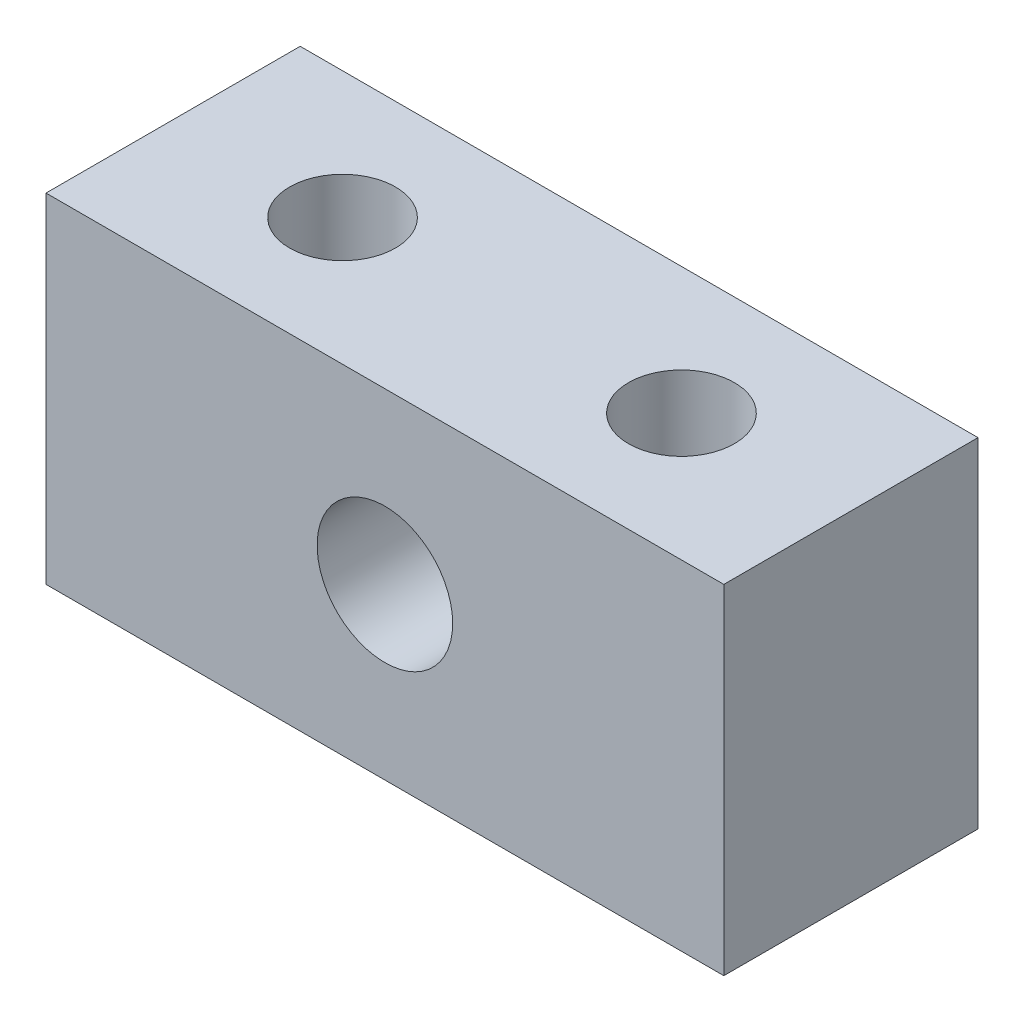
ISO-10303-21;
HEADER;
FILE_DESCRIPTION(('STEP AP214'),'2;1');
FILE_NAME('part.step','',(''),(''),'','','');
FILE_SCHEMA(('AUTOMOTIVE_DESIGN { 1 0 10303 214 1 1 1 1 }'));
ENDSEC;
DATA;
#1=APPLICATION_CONTEXT('core data for automotive mechanical design processes');
#2=APPLICATION_PROTOCOL_DEFINITION('international standard','automotive_design',2000,#1);
#3=PRODUCT_CONTEXT('',#1,'mechanical');
#4=PRODUCT('Part','Part','',(#3));
#5=PRODUCT_RELATED_PRODUCT_CATEGORY('part','',(#4));
#6=PRODUCT_DEFINITION_FORMATION('','',#4);
#7=PRODUCT_DEFINITION_CONTEXT('part definition',#1,'design');
#8=PRODUCT_DEFINITION('design','',#6,#7);
#9=PRODUCT_DEFINITION_SHAPE('','',#8);
#10=(LENGTH_UNIT() NAMED_UNIT(*) SI_UNIT(.MILLI.,.METRE.));
#11=(NAMED_UNIT(*) PLANE_ANGLE_UNIT() SI_UNIT($,.RADIAN.));
#12=(NAMED_UNIT(*) SI_UNIT($,.STERADIAN.) SOLID_ANGLE_UNIT());
#13=UNCERTAINTY_MEASURE_WITH_UNIT(LENGTH_MEASURE(1.E-05),#10,'distance_accuracy_value','');
#14=(GEOMETRIC_REPRESENTATION_CONTEXT(3) GLOBAL_UNCERTAINTY_ASSIGNED_CONTEXT((#13)) GLOBAL_UNIT_ASSIGNED_CONTEXT((#10,
#11,#12)) REPRESENTATION_CONTEXT('',''));
#15=CARTESIAN_POINT('',(0.,0.,0.));
#16=DIRECTION('',(0.,0.,1.));
#17=DIRECTION('',(1.,0.,0.));
#18=AXIS2_PLACEMENT_3D('',#15,#16,#17);
#19=CARTESIAN_POINT('',(-6.56603773584906,0.,6.));
#20=DIRECTION('',(1.,0.,0.));
#21=DIRECTION('',(0.,0.,-1.));
#22=AXIS2_PLACEMENT_3D('',#19,#20,#21);
#23=PLANE('',#22);
#24=DIRECTION('',(0.,-1.,0.));
#25=VECTOR('',#24,1.);
#26=CARTESIAN_POINT('',(-6.56603773584906,0.,0.));
#27=LINE('',#26,#25);
#28=CARTESIAN_POINT('',(-6.56603773584906,8.,0.));
#29=VERTEX_POINT('',#28);
#30=CARTESIAN_POINT('',(-6.56603773584906,0.,0.));
#31=VERTEX_POINT('',#30);
#32=EDGE_CURVE('E108',#29,#31,#27,.T.);
#33=ORIENTED_EDGE('',*,*,#32,.T.);
#34=DIRECTION('',(0.,0.,-1.));
#35=VECTOR('',#34,1.);
#36=CARTESIAN_POINT('',(-6.56603773584906,0.,6.));
#37=LINE('',#36,#35);
#38=CARTESIAN_POINT('',(-6.56603773584906,0.,6.));
#39=VERTEX_POINT('',#38);
#40=EDGE_CURVE('E13',#39,#31,#37,.T.);
#41=ORIENTED_EDGE('',*,*,#40,.F.);
#42=DIRECTION('',(0.,-1.,0.));
#43=VECTOR('',#42,1.);
#44=CARTESIAN_POINT('',(-6.56603773584906,0.,6.));
#45=LINE('',#44,#43);
#46=CARTESIAN_POINT('',(-6.56603773584906,8.,6.));
#47=VERTEX_POINT('',#46);
#48=EDGE_CURVE('E96',#47,#39,#45,.T.);
#49=ORIENTED_EDGE('',*,*,#48,.F.);
#50=DIRECTION('',(0.,0.,-1.));
#51=VECTOR('',#50,1.);
#52=CARTESIAN_POINT('',(-6.56603773584906,8.,6.));
#53=LINE('',#52,#51);
#54=EDGE_CURVE('E104',#47,#29,#53,.T.);
#55=ORIENTED_EDGE('',*,*,#54,.T.);
#56=EDGE_LOOP('',(#33,#41,#49,#55));
#57=FACE_BOUND('',#56,.T.);
#58=ADVANCED_FACE('F45',(#57),#23,.F.);
#59=CARTESIAN_POINT('',(-6.56603773584906,0.,6.));
#60=DIRECTION('',(0.,1.,0.));
#61=DIRECTION('',(0.,0.,1.));
#62=AXIS2_PLACEMENT_3D('',#59,#60,#61);
#63=PLANE('',#62);
#64=CARTESIAN_POINT('',(-2.56603773584906,0.,3.00000000000003));
#65=DIRECTION('',(0.,1.,0.));
#66=DIRECTION('',(0.,0.,1.));
#67=AXIS2_PLACEMENT_3D('',#64,#65,#66);
#68=CIRCLE('',#67,1.25);
#69=CARTESIAN_POINT('',(-2.56603773584906,0.,4.25000000000003));
#70=VERTEX_POINT('',#69);
#71=EDGE_CURVE('E127',#70,#70,#68,.T.);
#72=ORIENTED_EDGE('',*,*,#71,.T.);
#73=EDGE_LOOP('',(#72));
#74=FACE_BOUND('',#73,.T.);
#75=CARTESIAN_POINT('',(5.43396226415094,0.,3.00000000000003));
#76=DIRECTION('',(0.,1.,0.));
#77=DIRECTION('',(0.,0.,1.));
#78=AXIS2_PLACEMENT_3D('',#75,#76,#77);
#79=CIRCLE('',#78,1.25);
#80=CARTESIAN_POINT('',(5.43396226415094,0.,4.25000000000003));
#81=VERTEX_POINT('',#80);
#82=EDGE_CURVE('E111',#81,#81,#79,.T.);
#83=ORIENTED_EDGE('',*,*,#82,.T.);
#84=EDGE_LOOP('',(#83));
#85=FACE_BOUND('',#84,.T.);
#86=DIRECTION('',(1.,0.,0.));
#87=VECTOR('',#86,1.);
#88=CARTESIAN_POINT('',(-6.56603773584906,0.,0.));
#89=LINE('',#88,#87);
#90=CARTESIAN_POINT('',(9.43396226415094,0.,0.));
#91=VERTEX_POINT('',#90);
#92=EDGE_CURVE('E100',#31,#91,#89,.T.);
#93=ORIENTED_EDGE('',*,*,#92,.T.);
#94=DIRECTION('',(0.,0.,-1.));
#95=VECTOR('',#94,1.);
#96=CARTESIAN_POINT('',(9.43396226415094,0.,6.));
#97=LINE('',#96,#95);
#98=CARTESIAN_POINT('',(9.43396226415094,0.,6.));
#99=VERTEX_POINT('',#98);
#100=EDGE_CURVE('E53',#99,#91,#97,.T.);
#101=ORIENTED_EDGE('',*,*,#100,.F.);
#102=DIRECTION('',(1.,0.,0.));
#103=VECTOR('',#102,1.);
#104=CARTESIAN_POINT('',(-6.56603773584906,0.,6.));
#105=LINE('',#104,#103);
#106=EDGE_CURVE('E91',#39,#99,#105,.T.);
#107=ORIENTED_EDGE('',*,*,#106,.F.);
#108=ORIENTED_EDGE('',*,*,#40,.T.);
#109=EDGE_LOOP('',(#93,#101,#107,#108));
#110=FACE_BOUND('',#109,.T.);
#111=ADVANCED_FACE('F99',(#74,#85,#110),#63,.F.);
#112=CARTESIAN_POINT('',(9.43396226415094,0.,6.));
#113=DIRECTION('',(-1.,0.,0.));
#114=DIRECTION('',(0.,0.,1.));
#115=AXIS2_PLACEMENT_3D('',#112,#113,#114);
#116=PLANE('',#115);
#117=DIRECTION('',(0.,1.,0.));
#118=VECTOR('',#117,1.);
#119=CARTESIAN_POINT('',(9.43396226415094,0.,0.));
#120=LINE('',#119,#118);
#121=CARTESIAN_POINT('',(9.43396226415094,8.,0.));
#122=VERTEX_POINT('',#121);
#123=EDGE_CURVE('E78',#91,#122,#120,.T.);
#124=ORIENTED_EDGE('',*,*,#123,.T.);
#125=DIRECTION('',(0.,0.,-1.));
#126=VECTOR('',#125,1.);
#127=CARTESIAN_POINT('',(9.43396226415094,8.,6.));
#128=LINE('',#127,#126);
#129=CARTESIAN_POINT('',(9.43396226415094,8.,6.));
#130=VERTEX_POINT('',#129);
#131=EDGE_CURVE('E101',#130,#122,#128,.T.);
#132=ORIENTED_EDGE('',*,*,#131,.F.);
#133=DIRECTION('',(0.,1.,0.));
#134=VECTOR('',#133,1.);
#135=CARTESIAN_POINT('',(9.43396226415094,0.,6.));
#136=LINE('',#135,#134);
#137=EDGE_CURVE('E94',#99,#130,#136,.T.);
#138=ORIENTED_EDGE('',*,*,#137,.F.);
#139=ORIENTED_EDGE('',*,*,#100,.T.);
#140=EDGE_LOOP('',(#124,#132,#138,#139));
#141=FACE_BOUND('',#140,.T.);
#142=ADVANCED_FACE('F102',(#141),#116,.F.);
#143=CARTESIAN_POINT('',(-6.56603773584906,8.,6.));
#144=DIRECTION('',(0.,-1.,0.));
#145=DIRECTION('',(0.,0.,-1.));
#146=AXIS2_PLACEMENT_3D('',#143,#144,#145);
#147=PLANE('',#146);
#148=CARTESIAN_POINT('',(-2.56603773584906,8.,3.00000000000003));
#149=DIRECTION('',(0.,1.,0.));
#150=DIRECTION('',(0.,0.,1.));
#151=AXIS2_PLACEMENT_3D('',#148,#149,#150);
#152=CIRCLE('',#151,1.24999999999999);
#153=CARTESIAN_POINT('',(-2.56603773584906,8.,4.25000000000002));
#154=VERTEX_POINT('',#153);
#155=EDGE_CURVE('E130',#154,#154,#152,.T.);
#156=ORIENTED_EDGE('',*,*,#155,.F.);
#157=EDGE_LOOP('',(#156));
#158=FACE_BOUND('',#157,.T.);
#159=CARTESIAN_POINT('',(5.43396226415094,8.,3.00000000000003));
#160=DIRECTION('',(0.,1.,0.));
#161=DIRECTION('',(0.,0.,1.));
#162=AXIS2_PLACEMENT_3D('',#159,#160,#161);
#163=CIRCLE('',#162,1.24999999999999);
#164=CARTESIAN_POINT('',(5.43396226415094,8.,4.25000000000002));
#165=VERTEX_POINT('',#164);
#166=EDGE_CURVE('E124',#165,#165,#163,.T.);
#167=ORIENTED_EDGE('',*,*,#166,.F.);
#168=EDGE_LOOP('',(#167));
#169=FACE_BOUND('',#168,.T.);
#170=DIRECTION('',(-1.,0.,0.));
#171=VECTOR('',#170,1.);
#172=CARTESIAN_POINT('',(-6.56603773584906,8.,0.));
#173=LINE('',#172,#171);
#174=EDGE_CURVE('E84',#122,#29,#173,.T.);
#175=ORIENTED_EDGE('',*,*,#174,.T.);
#176=ORIENTED_EDGE('',*,*,#54,.F.);
#177=DIRECTION('',(-1.,0.,0.));
#178=VECTOR('',#177,1.);
#179=CARTESIAN_POINT('',(-6.56603773584906,8.,6.));
#180=LINE('',#179,#178);
#181=EDGE_CURVE('E61',#130,#47,#180,.T.);
#182=ORIENTED_EDGE('',*,*,#181,.F.);
#183=ORIENTED_EDGE('',*,*,#131,.T.);
#184=EDGE_LOOP('',(#175,#176,#182,#183));
#185=FACE_BOUND('',#184,.T.);
#186=ADVANCED_FACE('F116',(#158,#169,#185),#147,.F.);
#187=CARTESIAN_POINT('',(0.,0.,6.));
#188=DIRECTION('',(0.,0.,-1.));
#189=DIRECTION('',(-1.,0.,0.));
#190=AXIS2_PLACEMENT_3D('',#187,#188,#189);
#191=PLANE('',#190);
#192=CARTESIAN_POINT('',(1.43396226415094,3.99999999999999,6.));
#193=DIRECTION('',(0.,0.,1.));
#194=DIRECTION('',(1.,0.,0.));
#195=AXIS2_PLACEMENT_3D('',#192,#193,#194);
#196=CIRCLE('',#195,1.6);
#197=CARTESIAN_POINT('',(3.03396226415094,3.99999999999999,6.));
#198=VERTEX_POINT('',#197);
#199=EDGE_CURVE('E134',#198,#198,#196,.T.);
#200=ORIENTED_EDGE('',*,*,#199,.F.);
#201=EDGE_LOOP('',(#200));
#202=FACE_BOUND('',#201,.T.);
#203=ORIENTED_EDGE('',*,*,#48,.T.);
#204=ORIENTED_EDGE('',*,*,#106,.T.);
#205=ORIENTED_EDGE('',*,*,#137,.T.);
#206=ORIENTED_EDGE('',*,*,#181,.T.);
#207=EDGE_LOOP('',(#203,#204,#205,#206));
#208=FACE_BOUND('',#207,.T.);
#209=ADVANCED_FACE('F92',(#202,#208),#191,.F.);
#210=CARTESIAN_POINT('',(0.,0.,0.));
#211=DIRECTION('',(0.,0.,-1.));
#212=DIRECTION('',(-1.,0.,0.));
#213=AXIS2_PLACEMENT_3D('',#210,#211,#212);
#214=PLANE('',#213);
#215=CARTESIAN_POINT('',(1.43396226415094,3.99999999999999,0.));
#216=DIRECTION('',(0.,0.,1.));
#217=DIRECTION('',(1.,0.,0.));
#218=AXIS2_PLACEMENT_3D('',#215,#216,#217);
#219=CIRCLE('',#218,1.6);
#220=CARTESIAN_POINT('',(3.03396226415094,3.99999999999999,0.));
#221=VERTEX_POINT('',#220);
#222=EDGE_CURVE('E133',#221,#221,#219,.T.);
#223=ORIENTED_EDGE('',*,*,#222,.T.);
#224=EDGE_LOOP('',(#223));
#225=FACE_BOUND('',#224,.T.);
#226=ORIENTED_EDGE('',*,*,#32,.F.);
#227=ORIENTED_EDGE('',*,*,#174,.F.);
#228=ORIENTED_EDGE('',*,*,#123,.F.);
#229=ORIENTED_EDGE('',*,*,#92,.F.);
#230=EDGE_LOOP('',(#226,#227,#228,#229));
#231=FACE_BOUND('',#230,.T.);
#232=ADVANCED_FACE('F119',(#225,#231),#214,.T.);
#233=CARTESIAN_POINT('',(5.43396226415094,8.,3.00000000000003));
#234=DIRECTION('',(0.,1.,0.));
#235=DIRECTION('',(0.,0.,1.));
#236=AXIS2_PLACEMENT_3D('',#233,#234,#235);
#237=CYLINDRICAL_SURFACE('',#236,1.24999999999999);
#238=ORIENTED_EDGE('',*,*,#82,.F.);
#239=EDGE_LOOP('',(#238));
#240=FACE_BOUND('',#239,.T.);
#241=ORIENTED_EDGE('',*,*,#166,.T.);
#242=EDGE_LOOP('',(#241));
#243=FACE_BOUND('',#242,.T.);
#244=ADVANCED_FACE('F154',(#240,#243),#237,.F.);
#245=CARTESIAN_POINT('',(-2.56603773584906,8.,3.00000000000003));
#246=DIRECTION('',(0.,1.,0.));
#247=DIRECTION('',(0.,0.,1.));
#248=AXIS2_PLACEMENT_3D('',#245,#246,#247);
#249=CYLINDRICAL_SURFACE('',#248,1.24999999999999);
#250=ORIENTED_EDGE('',*,*,#71,.F.);
#251=EDGE_LOOP('',(#250));
#252=FACE_BOUND('',#251,.T.);
#253=ORIENTED_EDGE('',*,*,#155,.T.);
#254=EDGE_LOOP('',(#253));
#255=FACE_BOUND('',#254,.T.);
#256=ADVANCED_FACE('F144',(#252,#255),#249,.F.);
#257=CARTESIAN_POINT('',(1.43396226415094,3.99999999999999,0.));
#258=DIRECTION('',(0.,0.,1.));
#259=DIRECTION('',(1.,0.,0.));
#260=AXIS2_PLACEMENT_3D('',#257,#258,#259);
#261=CYLINDRICAL_SURFACE('',#260,1.6);
#262=ORIENTED_EDGE('',*,*,#222,.F.);
#263=EDGE_LOOP('',(#262));
#264=FACE_BOUND('',#263,.T.);
#265=ORIENTED_EDGE('',*,*,#199,.T.);
#266=EDGE_LOOP('',(#265));
#267=FACE_BOUND('',#266,.T.);
#268=ADVANCED_FACE('F141',(#264,#267),#261,.F.);
#269=CLOSED_SHELL('',(#58,#111,#142,#186,#209,#232,#244,#256,#268));
#270=MANIFOLD_SOLID_BREP('B2',#269);
#271=ADVANCED_BREP_SHAPE_REPRESENTATION('',(#18,#270),#14);
#272=SHAPE_DEFINITION_REPRESENTATION(#9,#271);
ENDSEC;
END-ISO-10303-21;
